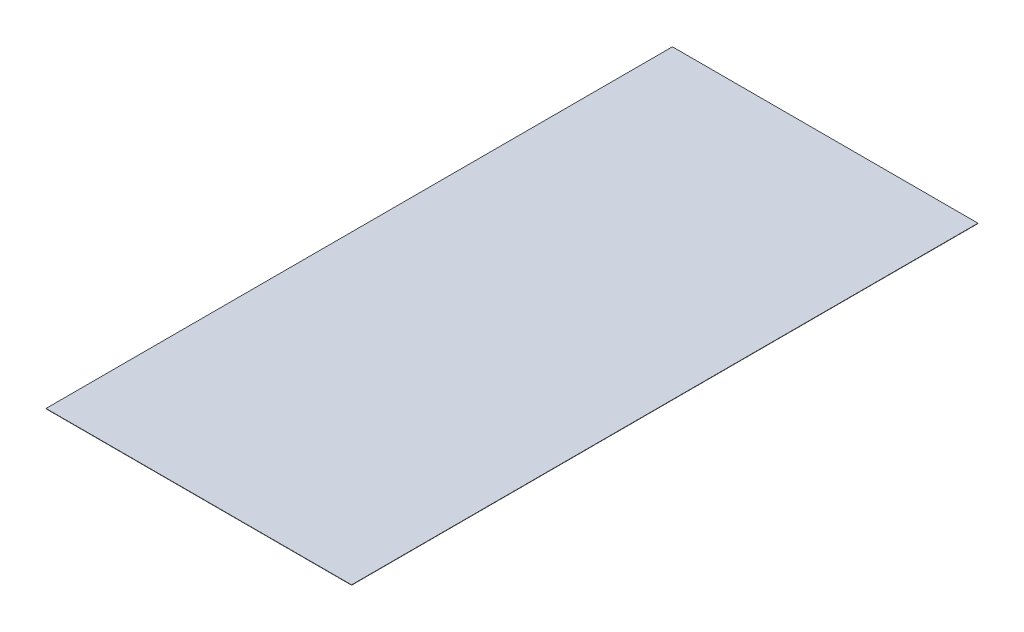
ISO-10303-21;
HEADER;
FILE_DESCRIPTION(('STEP AP214'),'2;1');
FILE_NAME('part.step','',(''),(''),'','','');
FILE_SCHEMA(('AUTOMOTIVE_DESIGN { 1 0 10303 214 1 1 1 1 }'));
ENDSEC;
DATA;
#1=APPLICATION_CONTEXT('core data for automotive mechanical design processes');
#2=APPLICATION_PROTOCOL_DEFINITION('international standard','automotive_design',2000,#1);
#3=PRODUCT_CONTEXT('',#1,'mechanical');
#4=PRODUCT('Part','Part','',(#3));
#5=PRODUCT_RELATED_PRODUCT_CATEGORY('part','',(#4));
#6=PRODUCT_DEFINITION_FORMATION('','',#4);
#7=PRODUCT_DEFINITION_CONTEXT('part definition',#1,'design');
#8=PRODUCT_DEFINITION('design','',#6,#7);
#9=PRODUCT_DEFINITION_SHAPE('','',#8);
#10=(LENGTH_UNIT() NAMED_UNIT(*) SI_UNIT(.MILLI.,.METRE.));
#11=(NAMED_UNIT(*) PLANE_ANGLE_UNIT() SI_UNIT($,.RADIAN.));
#12=(NAMED_UNIT(*) SI_UNIT($,.STERADIAN.) SOLID_ANGLE_UNIT());
#13=UNCERTAINTY_MEASURE_WITH_UNIT(LENGTH_MEASURE(1.E-05),#10,'distance_accuracy_value','');
#14=(GEOMETRIC_REPRESENTATION_CONTEXT(3) GLOBAL_UNCERTAINTY_ASSIGNED_CONTEXT((#13)) GLOBAL_UNIT_ASSIGNED_CONTEXT((#10,
#11,#12)) REPRESENTATION_CONTEXT('',''));
#15=CARTESIAN_POINT('',(0.,0.,0.));
#16=DIRECTION('',(0.,0.,1.));
#17=DIRECTION('',(1.,0.,0.));
#18=AXIS2_PLACEMENT_3D('',#15,#16,#17);
#19=CARTESIAN_POINT('',(-500.,1.,-1025.));
#20=DIRECTION('',(1.,0.,0.));
#21=DIRECTION('',(0.,0.,-1.));
#22=AXIS2_PLACEMENT_3D('',#19,#20,#21);
#23=PLANE('',#22);
#24=DIRECTION('',(0.,0.,1.));
#25=VECTOR('',#24,1.);
#26=CARTESIAN_POINT('',(-500.,0.,-1025.));
#27=LINE('',#26,#25);
#28=CARTESIAN_POINT('',(-500.,0.,-1025.));
#29=VERTEX_POINT('',#28);
#30=CARTESIAN_POINT('',(-500.,0.,1025.));
#31=VERTEX_POINT('',#30);
#32=EDGE_CURVE('E113',#29,#31,#27,.T.);
#33=ORIENTED_EDGE('',*,*,#32,.T.);
#34=DIRECTION('',(0.,-1.,0.));
#35=VECTOR('',#34,1.);
#36=CARTESIAN_POINT('',(-500.,1.,1025.));
#37=LINE('',#36,#35);
#38=CARTESIAN_POINT('',(-500.,1.,1025.));
#39=VERTEX_POINT('',#38);
#40=EDGE_CURVE('E11',#39,#31,#37,.T.);
#41=ORIENTED_EDGE('',*,*,#40,.F.);
#42=DIRECTION('',(0.,0.,1.));
#43=VECTOR('',#42,1.);
#44=CARTESIAN_POINT('',(-500.,1.,-1025.));
#45=LINE('',#44,#43);
#46=CARTESIAN_POINT('',(-500.,1.,-1025.));
#47=VERTEX_POINT('',#46);
#48=EDGE_CURVE('E97',#47,#39,#45,.T.);
#49=ORIENTED_EDGE('',*,*,#48,.F.);
#50=DIRECTION('',(0.,-1.,0.));
#51=VECTOR('',#50,1.);
#52=CARTESIAN_POINT('',(-500.,1.,-1025.));
#53=LINE('',#52,#51);
#54=EDGE_CURVE('E109',#47,#29,#53,.T.);
#55=ORIENTED_EDGE('',*,*,#54,.T.);
#56=EDGE_LOOP('',(#33,#41,#49,#55));
#57=FACE_BOUND('',#56,.T.);
#58=ADVANCED_FACE('F45',(#57),#23,.F.);
#59=CARTESIAN_POINT('',(500.,1.,1025.));
#60=DIRECTION('',(0.,0.,-1.));
#61=DIRECTION('',(-1.,0.,0.));
#62=AXIS2_PLACEMENT_3D('',#59,#60,#61);
#63=PLANE('',#62);
#64=DIRECTION('',(1.,0.,0.));
#65=VECTOR('',#64,1.);
#66=CARTESIAN_POINT('',(500.,0.,1025.));
#67=LINE('',#66,#65);
#68=CARTESIAN_POINT('',(500.,0.,1025.));
#69=VERTEX_POINT('',#68);
#70=EDGE_CURVE('E102',#31,#69,#67,.T.);
#71=ORIENTED_EDGE('',*,*,#70,.T.);
#72=DIRECTION('',(0.,-1.,0.));
#73=VECTOR('',#72,1.);
#74=CARTESIAN_POINT('',(500.,1.,1025.));
#75=LINE('',#74,#73);
#76=CARTESIAN_POINT('',(500.,1.,1025.));
#77=VERTEX_POINT('',#76);
#78=EDGE_CURVE('E54',#77,#69,#75,.T.);
#79=ORIENTED_EDGE('',*,*,#78,.F.);
#80=DIRECTION('',(1.,0.,0.));
#81=VECTOR('',#80,1.);
#82=CARTESIAN_POINT('',(500.,1.,1025.));
#83=LINE('',#82,#81);
#84=EDGE_CURVE('E92',#39,#77,#83,.T.);
#85=ORIENTED_EDGE('',*,*,#84,.F.);
#86=ORIENTED_EDGE('',*,*,#40,.T.);
#87=EDGE_LOOP('',(#71,#79,#85,#86));
#88=FACE_BOUND('',#87,.T.);
#89=ADVANCED_FACE('F101',(#88),#63,.F.);
#90=CARTESIAN_POINT('',(500.,1.,-1025.));
#91=DIRECTION('',(-1.,0.,0.));
#92=DIRECTION('',(0.,0.,1.));
#93=AXIS2_PLACEMENT_3D('',#90,#91,#92);
#94=PLANE('',#93);
#95=DIRECTION('',(0.,0.,-1.));
#96=VECTOR('',#95,1.);
#97=CARTESIAN_POINT('',(500.,0.,-1025.));
#98=LINE('',#97,#96);
#99=CARTESIAN_POINT('',(500.,0.,-1025.));
#100=VERTEX_POINT('',#99);
#101=EDGE_CURVE('E79',#69,#100,#98,.T.);
#102=ORIENTED_EDGE('',*,*,#101,.T.);
#103=DIRECTION('',(0.,-1.,0.));
#104=VECTOR('',#103,1.);
#105=CARTESIAN_POINT('',(500.,1.,-1025.));
#106=LINE('',#105,#104);
#107=CARTESIAN_POINT('',(500.,1.,-1025.));
#108=VERTEX_POINT('',#107);
#109=EDGE_CURVE('E104',#108,#100,#106,.T.);
#110=ORIENTED_EDGE('',*,*,#109,.F.);
#111=DIRECTION('',(0.,0.,-1.));
#112=VECTOR('',#111,1.);
#113=CARTESIAN_POINT('',(500.,1.,-1025.));
#114=LINE('',#113,#112);
#115=EDGE_CURVE('E95',#77,#108,#114,.T.);
#116=ORIENTED_EDGE('',*,*,#115,.F.);
#117=ORIENTED_EDGE('',*,*,#78,.T.);
#118=EDGE_LOOP('',(#102,#110,#116,#117));
#119=FACE_BOUND('',#118,.T.);
#120=ADVANCED_FACE('F105',(#119),#94,.F.);
#121=CARTESIAN_POINT('',(500.,1.,-1025.));
#122=DIRECTION('',(0.,0.,1.));
#123=DIRECTION('',(1.,0.,0.));
#124=AXIS2_PLACEMENT_3D('',#121,#122,#123);
#125=PLANE('',#124);
#126=DIRECTION('',(-1.,0.,0.));
#127=VECTOR('',#126,1.);
#128=CARTESIAN_POINT('',(500.,0.,-1025.));
#129=LINE('',#128,#127);
#130=EDGE_CURVE('E85',#100,#29,#129,.T.);
#131=ORIENTED_EDGE('',*,*,#130,.T.);
#132=ORIENTED_EDGE('',*,*,#54,.F.);
#133=DIRECTION('',(-1.,0.,0.));
#134=VECTOR('',#133,1.);
#135=CARTESIAN_POINT('',(500.,1.,-1025.));
#136=LINE('',#135,#134);
#137=EDGE_CURVE('E62',#108,#47,#136,.T.);
#138=ORIENTED_EDGE('',*,*,#137,.F.);
#139=ORIENTED_EDGE('',*,*,#109,.T.);
#140=EDGE_LOOP('',(#131,#132,#138,#139));
#141=FACE_BOUND('',#140,.T.);
#142=ADVANCED_FACE('F126',(#141),#125,.F.);
#143=CARTESIAN_POINT('',(0.,1.,0.));
#144=DIRECTION('',(0.,-1.,0.));
#145=DIRECTION('',(0.,0.,-1.));
#146=AXIS2_PLACEMENT_3D('',#143,#144,#145);
#147=PLANE('',#146);
#148=ORIENTED_EDGE('',*,*,#48,.T.);
#149=ORIENTED_EDGE('',*,*,#84,.T.);
#150=ORIENTED_EDGE('',*,*,#115,.T.);
#151=ORIENTED_EDGE('',*,*,#137,.T.);
#152=EDGE_LOOP('',(#148,#149,#150,#151));
#153=FACE_BOUND('',#152,.T.);
#154=ADVANCED_FACE('F93',(#153),#147,.F.);
#155=CARTESIAN_POINT('',(0.,0.,0.));
#156=DIRECTION('',(0.,-1.,0.));
#157=DIRECTION('',(0.,0.,-1.));
#158=AXIS2_PLACEMENT_3D('',#155,#156,#157);
#159=PLANE('',#158);
#160=ORIENTED_EDGE('',*,*,#32,.F.);
#161=ORIENTED_EDGE('',*,*,#130,.F.);
#162=ORIENTED_EDGE('',*,*,#101,.F.);
#163=ORIENTED_EDGE('',*,*,#70,.F.);
#164=EDGE_LOOP('',(#160,#161,#162,#163));
#165=FACE_BOUND('',#164,.T.);
#166=ADVANCED_FACE('F129',(#165),#159,.T.);
#167=CLOSED_SHELL('',(#58,#89,#120,#142,#154,#166));
#168=MANIFOLD_SOLID_BREP('B2',#167);
#169=ADVANCED_BREP_SHAPE_REPRESENTATION('',(#18,#168),#14);
#170=SHAPE_DEFINITION_REPRESENTATION(#9,#169);
ENDSEC;
END-ISO-10303-21;
